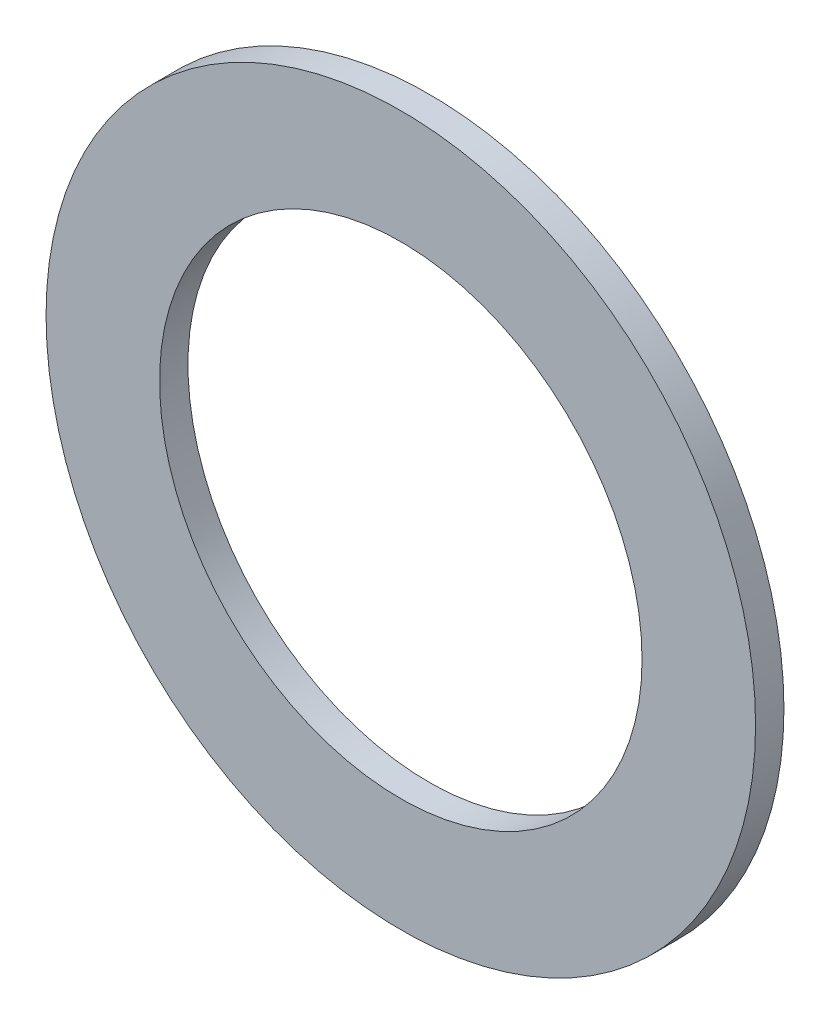
ISO-10303-21;
HEADER;
FILE_DESCRIPTION(('STEP AP214'),'2;1');
FILE_NAME('part.step','',(''),(''),'','','');
FILE_SCHEMA(('AUTOMOTIVE_DESIGN { 1 0 10303 214 1 1 1 1 }'));
ENDSEC;
DATA;
#1=APPLICATION_CONTEXT('core data for automotive mechanical design processes');
#2=APPLICATION_PROTOCOL_DEFINITION('international standard','automotive_design',2000,#1);
#3=PRODUCT_CONTEXT('',#1,'mechanical');
#4=PRODUCT('Part','Part','',(#3));
#5=PRODUCT_RELATED_PRODUCT_CATEGORY('part','',(#4));
#6=PRODUCT_DEFINITION_FORMATION('','',#4);
#7=PRODUCT_DEFINITION_CONTEXT('part definition',#1,'design');
#8=PRODUCT_DEFINITION('design','',#6,#7);
#9=PRODUCT_DEFINITION_SHAPE('','',#8);
#10=(LENGTH_UNIT() NAMED_UNIT(*) SI_UNIT(.MILLI.,.METRE.));
#11=(NAMED_UNIT(*) PLANE_ANGLE_UNIT() SI_UNIT($,.RADIAN.));
#12=(NAMED_UNIT(*) SI_UNIT($,.STERADIAN.) SOLID_ANGLE_UNIT());
#13=UNCERTAINTY_MEASURE_WITH_UNIT(LENGTH_MEASURE(1.E-05),#10,'distance_accuracy_value','');
#14=(GEOMETRIC_REPRESENTATION_CONTEXT(3) GLOBAL_UNCERTAINTY_ASSIGNED_CONTEXT((#13)) GLOBAL_UNIT_ASSIGNED_CONTEXT((#10,
#11,#12)) REPRESENTATION_CONTEXT('',''));
#15=CARTESIAN_POINT('',(0.,0.,0.));
#16=DIRECTION('',(0.,0.,1.));
#17=DIRECTION('',(1.,0.,0.));
#18=AXIS2_PLACEMENT_3D('',#15,#16,#17);
#19=CARTESIAN_POINT('',(0.,0.,2.));
#20=DIRECTION('',(0.,0.,1.));
#21=DIRECTION('',(1.,0.,0.));
#22=AXIS2_PLACEMENT_3D('',#19,#20,#21);
#23=PLANE('',#22);
#24=CARTESIAN_POINT('',(0.,0.,2.));
#25=DIRECTION('',(0.,0.,1.));
#26=DIRECTION('',(1.,0.,0.));
#27=AXIS2_PLACEMENT_3D('',#24,#25,#26);
#28=CIRCLE('',#27,25.);
#29=CARTESIAN_POINT('',(25.,0.,2.));
#30=VERTEX_POINT('',#29);
#31=EDGE_CURVE('E10',#30,#30,#28,.T.);
#32=ORIENTED_EDGE('',*,*,#31,.T.);
#33=EDGE_LOOP('',(#32));
#34=FACE_BOUND('',#33,.T.);
#35=CARTESIAN_POINT('',(0.,0.,2.));
#36=DIRECTION('',(0.,0.,1.));
#37=DIRECTION('',(1.,0.,0.));
#38=AXIS2_PLACEMENT_3D('',#35,#36,#37);
#39=CIRCLE('',#38,17.);
#40=CARTESIAN_POINT('',(17.,0.,2.));
#41=VERTEX_POINT('',#40);
#42=EDGE_CURVE('E44',#41,#41,#39,.T.);
#43=ORIENTED_EDGE('',*,*,#42,.F.);
#44=EDGE_LOOP('',(#43));
#45=FACE_BOUND('',#44,.T.);
#46=ADVANCED_FACE('F33',(#34,#45),#23,.T.);
#47=CARTESIAN_POINT('',(0.,0.,0.));
#48=DIRECTION('',(0.,0.,1.));
#49=DIRECTION('',(1.,0.,0.));
#50=AXIS2_PLACEMENT_3D('',#47,#48,#49);
#51=PLANE('',#50);
#52=CARTESIAN_POINT('',(0.,0.,0.));
#53=DIRECTION('',(0.,0.,1.));
#54=DIRECTION('',(1.,0.,0.));
#55=AXIS2_PLACEMENT_3D('',#52,#53,#54);
#56=CIRCLE('',#55,25.);
#57=CARTESIAN_POINT('',(25.,0.,0.));
#58=VERTEX_POINT('',#57);
#59=EDGE_CURVE('E40',#58,#58,#56,.T.);
#60=ORIENTED_EDGE('',*,*,#59,.F.);
#61=EDGE_LOOP('',(#60));
#62=FACE_BOUND('',#61,.T.);
#63=CARTESIAN_POINT('',(0.,0.,0.));
#64=DIRECTION('',(0.,0.,1.));
#65=DIRECTION('',(1.,0.,0.));
#66=AXIS2_PLACEMENT_3D('',#63,#64,#65);
#67=CIRCLE('',#66,17.);
#68=CARTESIAN_POINT('',(17.,0.,0.));
#69=VERTEX_POINT('',#68);
#70=EDGE_CURVE('E48',#69,#69,#67,.T.);
#71=ORIENTED_EDGE('',*,*,#70,.T.);
#72=EDGE_LOOP('',(#71));
#73=FACE_BOUND('',#72,.T.);
#74=ADVANCED_FACE('F54',(#62,#73),#51,.F.);
#75=CARTESIAN_POINT('',(0.,0.,2.));
#76=DIRECTION('',(0.,0.,-1.));
#77=DIRECTION('',(-1.,0.,0.));
#78=AXIS2_PLACEMENT_3D('',#75,#76,#77);
#79=CYLINDRICAL_SURFACE('',#78,25.);
#80=ORIENTED_EDGE('',*,*,#31,.F.);
#81=EDGE_LOOP('',(#80));
#82=FACE_BOUND('',#81,.T.);
#83=ORIENTED_EDGE('',*,*,#59,.T.);
#84=EDGE_LOOP('',(#83));
#85=FACE_BOUND('',#84,.T.);
#86=ADVANCED_FACE('F35',(#82,#85),#79,.T.);
#87=CARTESIAN_POINT('',(0.,0.,2.));
#88=DIRECTION('',(0.,0.,-1.));
#89=DIRECTION('',(-1.,0.,0.));
#90=AXIS2_PLACEMENT_3D('',#87,#88,#89);
#91=CYLINDRICAL_SURFACE('',#90,17.);
#92=ORIENTED_EDGE('',*,*,#42,.T.);
#93=EDGE_LOOP('',(#92));
#94=FACE_BOUND('',#93,.T.);
#95=ORIENTED_EDGE('',*,*,#70,.F.);
#96=EDGE_LOOP('',(#95));
#97=FACE_BOUND('',#96,.T.);
#98=ADVANCED_FACE('F56',(#94,#97),#91,.F.);
#99=CLOSED_SHELL('',(#46,#74,#86,#98));
#100=MANIFOLD_SOLID_BREP('B2',#99);
#101=ADVANCED_BREP_SHAPE_REPRESENTATION('',(#18,#100),#14);
#102=SHAPE_DEFINITION_REPRESENTATION(#9,#101);
ENDSEC;
END-ISO-10303-21;
